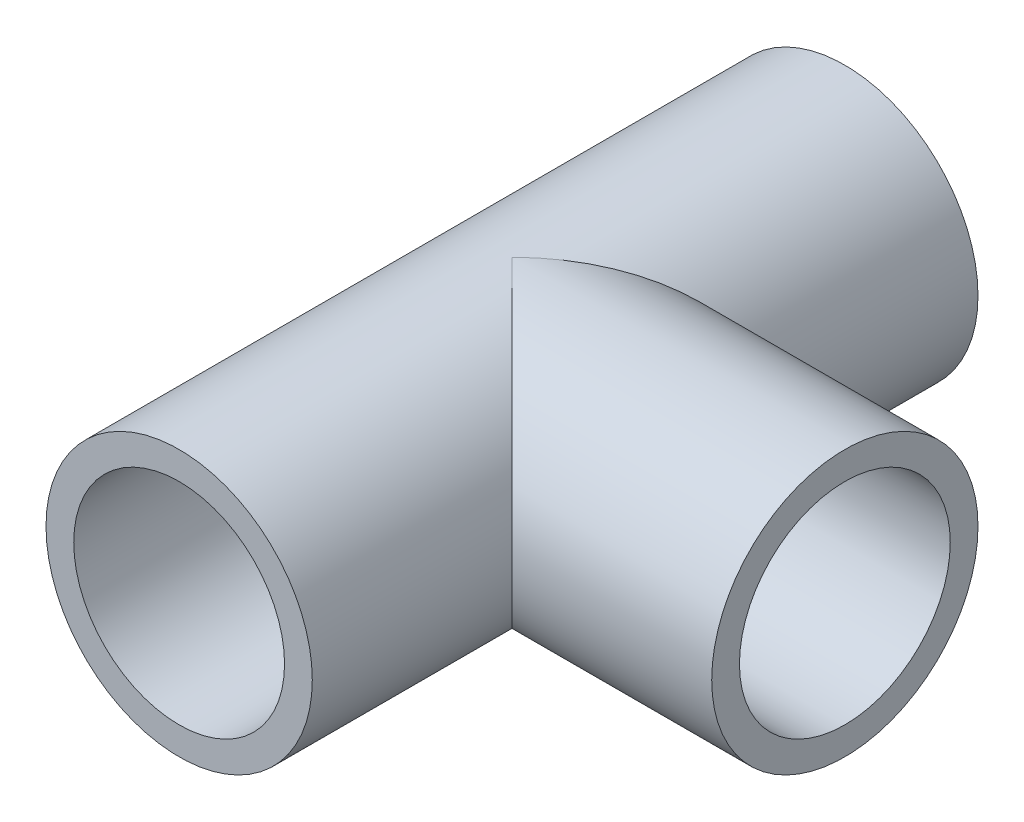
ISO-10303-21;
HEADER;
FILE_DESCRIPTION(('STEP AP214'),'2;1');
FILE_NAME('part.step','',(''),(''),'','','');
FILE_SCHEMA(('AUTOMOTIVE_DESIGN { 1 0 10303 214 1 1 1 1 }'));
ENDSEC;
DATA;
#1=APPLICATION_CONTEXT('core data for automotive mechanical design processes');
#2=APPLICATION_PROTOCOL_DEFINITION('international standard','automotive_design',2000,#1);
#3=PRODUCT_CONTEXT('',#1,'mechanical');
#4=PRODUCT('Part','Part','',(#3));
#5=PRODUCT_RELATED_PRODUCT_CATEGORY('part','',(#4));
#6=PRODUCT_DEFINITION_FORMATION('','',#4);
#7=PRODUCT_DEFINITION_CONTEXT('part definition',#1,'design');
#8=PRODUCT_DEFINITION('design','',#6,#7);
#9=PRODUCT_DEFINITION_SHAPE('','',#8);
#10=(LENGTH_UNIT() NAMED_UNIT(*) SI_UNIT(.MILLI.,.METRE.));
#11=(NAMED_UNIT(*) PLANE_ANGLE_UNIT() SI_UNIT($,.RADIAN.));
#12=(NAMED_UNIT(*) SI_UNIT($,.STERADIAN.) SOLID_ANGLE_UNIT());
#13=UNCERTAINTY_MEASURE_WITH_UNIT(LENGTH_MEASURE(1.E-05),#10,'distance_accuracy_value','');
#14=(GEOMETRIC_REPRESENTATION_CONTEXT(3) GLOBAL_UNCERTAINTY_ASSIGNED_CONTEXT((#13)) GLOBAL_UNIT_ASSIGNED_CONTEXT((#10,
#11,#12)) REPRESENTATION_CONTEXT('',''));
#15=CARTESIAN_POINT('',(0.,0.,0.));
#16=DIRECTION('',(0.,0.,1.));
#17=DIRECTION('',(1.,0.,0.));
#18=AXIS2_PLACEMENT_3D('',#15,#16,#17);
#19=CARTESIAN_POINT('',(0.,0.,152.4));
#20=DIRECTION('',(0.,0.,1.));
#21=DIRECTION('',(1.,0.,0.));
#22=AXIS2_PLACEMENT_3D('',#19,#20,#21);
#23=PLANE('',#22);
#24=CARTESIAN_POINT('',(0.,0.,152.4));
#25=DIRECTION('',(0.,0.,1.));
#26=DIRECTION('',(1.,0.,0.));
#27=AXIS2_PLACEMENT_3D('',#24,#25,#26);
#28=CIRCLE('',#27,30.48);
#29=CARTESIAN_POINT('',(30.48,0.,152.4));
#30=VERTEX_POINT('',#29);
#31=EDGE_CURVE('E58',#30,#30,#28,.T.);
#32=ORIENTED_EDGE('',*,*,#31,.T.);
#33=EDGE_LOOP('',(#32));
#34=FACE_BOUND('',#33,.T.);
#35=CARTESIAN_POINT('',(0.,0.,152.4));
#36=DIRECTION('',(0.,0.,1.));
#37=DIRECTION('',(1.,0.,0.));
#38=AXIS2_PLACEMENT_3D('',#35,#36,#37);
#39=CIRCLE('',#38,24.13);
#40=CARTESIAN_POINT('',(-24.13,0.,152.4));
#41=VERTEX_POINT('',#40);
#42=EDGE_CURVE('E87',#41,#41,#39,.T.);
#43=ORIENTED_EDGE('',*,*,#42,.F.);
#44=EDGE_LOOP('',(#43));
#45=FACE_BOUND('',#44,.T.);
#46=ADVANCED_FACE('F45',(#34,#45),#23,.T.);
#47=CARTESIAN_POINT('',(0.,0.,0.));
#48=DIRECTION('',(0.,0.,1.));
#49=DIRECTION('',(1.,0.,0.));
#50=AXIS2_PLACEMENT_3D('',#47,#48,#49);
#51=PLANE('',#50);
#52=CARTESIAN_POINT('',(0.,0.,0.));
#53=DIRECTION('',(0.,0.,1.));
#54=DIRECTION('',(1.,0.,0.));
#55=AXIS2_PLACEMENT_3D('',#52,#53,#54);
#56=CIRCLE('',#55,30.48);
#57=CARTESIAN_POINT('',(30.48,0.,0.));
#58=VERTEX_POINT('',#57);
#59=EDGE_CURVE('E91',#58,#58,#56,.T.);
#60=ORIENTED_EDGE('',*,*,#59,.F.);
#61=EDGE_LOOP('',(#60));
#62=FACE_BOUND('',#61,.T.);
#63=CARTESIAN_POINT('',(0.,0.,0.));
#64=DIRECTION('',(0.,0.,1.));
#65=DIRECTION('',(1.,0.,0.));
#66=AXIS2_PLACEMENT_3D('',#63,#64,#65);
#67=CIRCLE('',#66,24.13);
#68=CARTESIAN_POINT('',(-24.13,0.,0.));
#69=VERTEX_POINT('',#68);
#70=EDGE_CURVE('E83',#69,#69,#67,.T.);
#71=ORIENTED_EDGE('',*,*,#70,.T.);
#72=EDGE_LOOP('',(#71));
#73=FACE_BOUND('',#72,.T.);
#74=ADVANCED_FACE('F101',(#62,#73),#51,.F.);
#75=CARTESIAN_POINT('',(0.,0.,152.4));
#76=DIRECTION('',(0.,0.,-1.));
#77=DIRECTION('',(-1.,0.,0.));
#78=AXIS2_PLACEMENT_3D('',#75,#76,#77);
#79=CYLINDRICAL_SURFACE('',#78,30.48);
#80=CARTESIAN_POINT('',(5.6843418860808E-11,0.,76.2));
#81=DIRECTION('',(0.707106781186548,0.,0.707106781186547));
#82=DIRECTION('',(0.707106781186548,0.,-0.707106781186547));
#83=AXIS2_PLACEMENT_3D('',#80,#81,#82);
#84=ELLIPSE('',#83,43.1052293811319,30.48);
#85=CARTESIAN_POINT('',(0.,-30.48,76.2));
#86=VERTEX_POINT('',#85);
#87=CARTESIAN_POINT('',(5.6843418860808E-11,30.48,76.2));
#88=VERTEX_POINT('',#87);
#89=EDGE_CURVE('E68',#86,#88,#84,.T.);
#90=ORIENTED_EDGE('',*,*,#89,.F.);
#91=CARTESIAN_POINT('',(5.6843418860808E-11,0.,76.2));
#92=DIRECTION('',(0.707106781186548,0.,-0.707106781186547));
#93=DIRECTION('',(0.707106781186548,0.,0.707106781186547));
#94=AXIS2_PLACEMENT_3D('',#91,#92,#93);
#95=ELLIPSE('',#94,43.1052293811319,30.48);
#96=EDGE_CURVE('E66',#88,#86,#95,.T.);
#97=ORIENTED_EDGE('',*,*,#96,.F.);
#98=EDGE_LOOP('',(#90,#97));
#99=FACE_BOUND('',#98,.T.);
#100=ORIENTED_EDGE('',*,*,#31,.F.);
#101=EDGE_LOOP('',(#100));
#102=FACE_BOUND('',#101,.T.);
#103=ORIENTED_EDGE('',*,*,#59,.T.);
#104=EDGE_LOOP('',(#103));
#105=FACE_BOUND('',#104,.T.);
#106=ADVANCED_FACE('F47',(#99,#102,#105),#79,.T.);
#107=CARTESIAN_POINT('',(0.,0.,152.4));
#108=DIRECTION('',(0.,0.,-1.));
#109=DIRECTION('',(-1.,0.,0.));
#110=AXIS2_PLACEMENT_3D('',#107,#108,#109);
#111=CYLINDRICAL_SURFACE('',#110,24.13);
#112=CARTESIAN_POINT('',(-24.13,0.,152.4));
#113=CARTESIAN_POINT('',(-24.13,0.,150.8125));
#114=CARTESIAN_POINT('',(-24.13,0.,149.225));
#115=CARTESIAN_POINT('',(-24.13,0.,146.05));
#116=CARTESIAN_POINT('',(-24.13,0.,144.4625));
#117=CARTESIAN_POINT('',(-24.13,0.,141.2875));
#118=CARTESIAN_POINT('',(-24.13,0.,139.7));
#119=CARTESIAN_POINT('',(-24.13,0.,136.525));
#120=CARTESIAN_POINT('',(-24.13,0.,134.9375));
#121=CARTESIAN_POINT('',(-24.13,0.,131.7625));
#122=CARTESIAN_POINT('',(-24.13,0.,130.175));
#123=CARTESIAN_POINT('',(-24.13,0.,127.));
#124=CARTESIAN_POINT('',(-24.13,0.,125.4125));
#125=CARTESIAN_POINT('',(-24.13,0.,122.2375));
#126=CARTESIAN_POINT('',(-24.13,0.,120.65));
#127=CARTESIAN_POINT('',(-24.13,0.,117.475));
#128=CARTESIAN_POINT('',(-24.13,0.,115.8875));
#129=CARTESIAN_POINT('',(-24.13,0.,112.7125));
#130=CARTESIAN_POINT('',(-24.13,0.,111.125));
#131=CARTESIAN_POINT('',(-24.13,0.,107.95));
#132=CARTESIAN_POINT('',(-24.13,0.,106.3625));
#133=CARTESIAN_POINT('',(-24.13,0.,103.1875));
#134=CARTESIAN_POINT('',(-24.13,0.,101.6));
#135=CARTESIAN_POINT('',(-24.13,0.,98.425));
#136=CARTESIAN_POINT('',(-24.13,0.,96.8375));
#137=CARTESIAN_POINT('',(-24.13,0.,93.6625));
#138=CARTESIAN_POINT('',(-24.13,0.,92.075));
#139=CARTESIAN_POINT('',(-24.13,0.,88.9));
#140=CARTESIAN_POINT('',(-24.13,0.,87.3125));
#141=CARTESIAN_POINT('',(-24.13,0.,84.1375));
#142=CARTESIAN_POINT('',(-24.13,0.,82.55));
#143=CARTESIAN_POINT('',(-24.13,0.,79.375));
#144=CARTESIAN_POINT('',(-24.13,0.,77.7875));
#145=CARTESIAN_POINT('',(-24.13,0.,74.6125));
#146=CARTESIAN_POINT('',(-24.13,0.,73.025));
#147=CARTESIAN_POINT('',(-24.13,0.,69.85));
#148=CARTESIAN_POINT('',(-24.13,0.,68.2625));
#149=CARTESIAN_POINT('',(-24.13,0.,65.0875));
#150=CARTESIAN_POINT('',(-24.13,0.,63.5));
#151=CARTESIAN_POINT('',(-24.13,0.,60.325));
#152=CARTESIAN_POINT('',(-24.13,0.,58.7375));
#153=CARTESIAN_POINT('',(-24.13,0.,55.5625));
#154=CARTESIAN_POINT('',(-24.13,0.,53.975));
#155=CARTESIAN_POINT('',(-24.13,0.,50.8));
#156=CARTESIAN_POINT('',(-24.13,0.,49.2125));
#157=CARTESIAN_POINT('',(-24.13,0.,46.0375));
#158=CARTESIAN_POINT('',(-24.13,0.,44.45));
#159=CARTESIAN_POINT('',(-24.13,0.,41.275));
#160=CARTESIAN_POINT('',(-24.13,0.,39.6875));
#161=CARTESIAN_POINT('',(-24.13,0.,36.5125));
#162=CARTESIAN_POINT('',(-24.13,0.,34.925));
#163=CARTESIAN_POINT('',(-24.13,0.,31.75));
#164=CARTESIAN_POINT('',(-24.13,0.,30.1625));
#165=CARTESIAN_POINT('',(-24.13,0.,26.9875));
#166=CARTESIAN_POINT('',(-24.13,0.,25.4));
#167=CARTESIAN_POINT('',(-24.13,0.,22.225));
#168=CARTESIAN_POINT('',(-24.13,0.,20.6375));
#169=CARTESIAN_POINT('',(-24.13,0.,17.4625));
#170=CARTESIAN_POINT('',(-24.13,0.,15.875));
#171=CARTESIAN_POINT('',(-24.13,0.,12.7));
#172=CARTESIAN_POINT('',(-24.13,0.,11.1125));
#173=CARTESIAN_POINT('',(-24.13,0.,7.93750000000001));
#174=CARTESIAN_POINT('',(-24.13,0.,6.35));
#175=CARTESIAN_POINT('',(-24.13,0.,3.175));
#176=CARTESIAN_POINT('',(-24.13,0.,1.5875));
#177=CARTESIAN_POINT('',(-24.13,0.,0.));
#178=B_SPLINE_CURVE_WITH_KNOTS('',3,(#112,#113,#114,#115,#116,#117,#118,#119,#120,#121,#122,
#123,#124,#125,#126,#127,#128,#129,#130,#131,#132,#133,#134,#135,#136,#137,#138,#139,#140,#141,
#142,#143,#144,#145,#146,#147,#148,#149,#150,#151,#152,#153,#154,#155,#156,#157,#158,#159,#160,
#161,#162,#163,#164,#165,#166,#167,#168,#169,#170,#171,#172,#173,#174,#175,#176,#177),
.UNSPECIFIED.,.F.,.F.,(4,2,2,2,2,2,2,2,2,2,2,2,2,2,2,2,2,2,2,2,2,2,2,2,2,2,2,2,2,2,2,2,4),(0.,
4.7625,9.52500000000001,14.2875,19.05,23.8125,28.575,33.3375,38.1,42.8625,47.625,52.3875,57.15,
61.9125,66.675,71.4375,76.2,80.9625,85.725,90.4875,95.25,100.0125,104.775,109.5375,114.3,
119.0625,123.825,128.5875,133.35,138.1125,142.875,147.6375,152.4),.UNSPECIFIED.);
#179=EDGE_CURVE('BSEAM106',#41,#69,#178,.T.);
#180=ORIENTED_EDGE('',*,*,#42,.T.);
#181=ORIENTED_EDGE('',*,*,#70,.F.);
#182=ORIENTED_EDGE('',*,*,#179,.T.);
#183=ORIENTED_EDGE('',*,*,#179,.F.);
#184=EDGE_LOOP('',(#180,#182,#181,#183));
#185=FACE_BOUND('',#184,.T.);
#186=ADVANCED_FACE('F106',(#185),#111,.F.);
#187=CARTESIAN_POINT('',(76.2,0.,76.2));
#188=DIRECTION('',(1.,0.,0.));
#189=DIRECTION('',(0.,0.,-1.));
#190=AXIS2_PLACEMENT_3D('',#187,#188,#189);
#191=PLANE('',#190);
#192=CARTESIAN_POINT('',(76.2,0.,76.2));
#193=DIRECTION('',(1.,0.,0.));
#194=DIRECTION('',(0.,0.,-1.));
#195=AXIS2_PLACEMENT_3D('',#192,#193,#194);
#196=CIRCLE('',#195,24.13);
#197=CARTESIAN_POINT('',(76.2,0.,52.07));
#198=VERTEX_POINT('',#197);
#199=EDGE_CURVE('E72',#198,#198,#196,.T.);
#200=ORIENTED_EDGE('',*,*,#199,.F.);
#201=EDGE_LOOP('',(#200));
#202=FACE_BOUND('',#201,.T.);
#203=CARTESIAN_POINT('',(76.2,0.,76.2));
#204=DIRECTION('',(1.,0.,0.));
#205=DIRECTION('',(0.,0.,-1.));
#206=AXIS2_PLACEMENT_3D('',#203,#204,#205);
#207=CIRCLE('',#206,30.48);
#208=CARTESIAN_POINT('',(76.2,0.,45.72));
#209=VERTEX_POINT('',#208);
#210=EDGE_CURVE('E79',#209,#209,#207,.T.);
#211=ORIENTED_EDGE('',*,*,#210,.T.);
#212=EDGE_LOOP('',(#211));
#213=FACE_BOUND('',#212,.T.);
#214=ADVANCED_FACE('F108',(#202,#213),#191,.T.);
#215=CARTESIAN_POINT('',(-500000.,0.,76.2));
#216=DIRECTION('',(1.,0.,0.));
#217=DIRECTION('',(0.,0.,-1.));
#218=AXIS2_PLACEMENT_3D('',#215,#216,#217);
#219=CYLINDRICAL_SURFACE('',#218,30.48);
#220=ORIENTED_EDGE('',*,*,#210,.F.);
#221=EDGE_LOOP('',(#220));
#222=FACE_BOUND('',#221,.T.);
#223=ORIENTED_EDGE('',*,*,#89,.T.);
#224=ORIENTED_EDGE('',*,*,#96,.T.);
#225=EDGE_LOOP('',(#223,#224));
#226=FACE_BOUND('',#225,.T.);
#227=ADVANCED_FACE('F69',(#222,#226),#219,.T.);
#228=CARTESIAN_POINT('',(-500000.,0.,76.2));
#229=DIRECTION('',(1.,0.,0.));
#230=DIRECTION('',(0.,0.,-1.));
#231=AXIS2_PLACEMENT_3D('',#228,#229,#230);
#232=CYLINDRICAL_SURFACE('',#231,24.13);
#233=ORIENTED_EDGE('',*,*,#199,.T.);
#234=EDGE_LOOP('',(#233));
#235=FACE_BOUND('',#234,.T.);
#236=CARTESIAN_POINT('',(30.4800000001137,0.,52.07));
#237=CARTESIAN_POINT('',(30.4799985942119,-0.581246894137445,52.0700014456354));
#238=CARTESIAN_POINT('',(30.4633388317552,-1.16251470497403,52.091035349071));
#239=CARTESIAN_POINT('',(30.3970841513564,-2.32037410054405,52.1748074891283));
#240=CARTESIAN_POINT('',(30.3474747640671,-2.89696351818204,52.2375640476573));
#241=CARTESIAN_POINT('',(30.2163718223756,-4.04148642333223,52.403818789128));
#242=CARTESIAN_POINT('',(30.1348272642911,-4.60940454687885,52.5073821462631));
#243=CARTESIAN_POINT('',(29.9417004169538,-5.73140885237527,52.753513298852));
#244=CARTESIAN_POINT('',(29.8301207860515,-6.28549625371716,52.8960776424164));
#245=CARTESIAN_POINT('',(29.580049299476,-7.3729554111217,53.2170526205287));
#246=CARTESIAN_POINT('',(29.4417297807024,-7.90643488721635,53.3952339433838));
#247=CARTESIAN_POINT('',(29.1403774063328,-8.95352707975394,53.7856408718759));
#248=CARTESIAN_POINT('',(28.9773445357199,-9.46713978412478,53.9978664981997));
#249=CARTESIAN_POINT('',(28.6294317444963,-10.472291669237,54.4539063097545));
#250=CARTESIAN_POINT('',(28.4445552601586,-10.9638343051306,54.6977155270727));
#251=CARTESIAN_POINT('',(28.0558015884944,-11.9235263112645,55.2146824691518));
#252=CARTESIAN_POINT('',(27.851920555446,-12.3916709171557,55.4878461357363));
#253=CARTESIAN_POINT('',(27.4977387757521,-13.153661272496,55.9671318513638));
#254=CARTESIAN_POINT('',(27.3518215745773,-13.4542731656338,56.1658225757648));
#255=CARTESIAN_POINT('',(27.0536857454353,-14.0441335745673,56.5748124928946));
#256=CARTESIAN_POINT('',(26.9014684672375,-14.3333844987928,56.7851092022682));
#257=CARTESIAN_POINT('',(26.4365242436193,-15.1841428488301,57.4328230796393));
#258=CARTESIAN_POINT('',(26.1155536871627,-15.7285520655082,57.8869984257711));
#259=CARTESIAN_POINT('',(25.4580648187886,-16.7719629712082,58.8374619562241));
#260=CARTESIAN_POINT('',(25.1215078129702,-17.2708413912156,59.333857822967));
#261=CARTESIAN_POINT('',(24.4409695726738,-18.2211638416936,60.3652986931174));
#262=CARTESIAN_POINT('',(24.0969891590444,-18.6726130846125,60.9003394385388));
#263=CARTESIAN_POINT('',(23.4043643390173,-19.5339711800464,62.0160272651951));
#264=CARTESIAN_POINT('',(23.0557272249272,-19.9431567491534,62.5972373064217));
#265=CARTESIAN_POINT('',(22.368327400478,-20.7112017051216,63.7979412423459));
#266=CARTESIAN_POINT('',(22.0295677561269,-21.0700455947201,64.4174468418264));
#267=CARTESIAN_POINT('',(21.374464086002,-21.7342955630196,65.6931839152401));
#268=CARTESIAN_POINT('',(21.0580595106444,-22.0398495616398,66.3493068338784));
#269=CARTESIAN_POINT('',(20.4610451480448,-22.5951764674894,67.7001604063365));
#270=CARTESIAN_POINT('',(20.180405167555,-22.8449965620533,68.3948577737236));
#271=CARTESIAN_POINT('',(19.7786556836564,-23.1921014390932,69.5237585155298));
#272=CARTESIAN_POINT('',(19.639874786779,-23.309513058134,69.945562788649));
#273=CARTESIAN_POINT('',(19.384359305397,-23.5224285366047,70.8012468114712));
#274=CARTESIAN_POINT('',(19.2676211131563,-23.6179359816476,71.235124571742));
#275=CARTESIAN_POINT('',(19.0603980147066,-23.7854874129787,72.1126352892581));
#276=CARTESIAN_POINT('',(18.9698588324466,-23.8575799460593,72.5562460003592));
#277=CARTESIAN_POINT('',(18.8183768590692,-23.9772488230444,73.4518249767898));
#278=CARTESIAN_POINT('',(18.7574337555717,-24.0248254257094,73.903793153856));
#279=CARTESIAN_POINT('',(18.667598676156,-24.0946981440808,74.8166600757999));
#280=CARTESIAN_POINT('',(18.6389734104413,-24.1167839238524,75.277601651473));
#281=CARTESIAN_POINT('',(18.6161373246142,-24.1344163111447,76.2008366939014));
#282=CARTESIAN_POINT('',(18.6219250552584,-24.1299640362696,76.663130102907));
#283=CARTESIAN_POINT('',(18.6676304715153,-24.0946214837498,77.5853697187871));
#284=CARTESIAN_POINT('',(18.7075763769761,-24.0637093462126,78.0453136685015));
#285=CARTESIAN_POINT('',(18.8196352543896,-23.9761697885603,78.9587728587098));
#286=CARTESIAN_POINT('',(18.8917527560269,-23.9195387472642,79.4122871846471));
#287=CARTESIAN_POINT('',(19.079656803023,-23.7700199262005,80.3863313433118));
#288=CARTESIAN_POINT('',(19.2007864190838,-23.672602004331,80.9051311549329));
#289=CARTESIAN_POINT('',(19.4763135689404,-23.4464338144467,81.9267461266002));
#290=CARTESIAN_POINT('',(19.6307185989135,-23.3176764855449,82.4295576555205));
#291=CARTESIAN_POINT('',(19.9666329051073,-23.0306929984754,83.4187228254217));
#292=CARTESIAN_POINT('',(20.1482062348666,-22.8723969741616,83.9050341480601));
#293=CARTESIAN_POINT('',(20.5320936583173,-22.5284268138105,84.8593417759689));
#294=CARTESIAN_POINT('',(20.7344093369573,-22.3427505851416,85.3273366778777));
#295=CARTESIAN_POINT('',(21.2522157831925,-21.8529819454625,86.4587189945083));
#296=CARTESIAN_POINT('',(21.5765483148017,-21.5340020474779,87.1116472010037));
#297=CARTESIAN_POINT('',(22.2443123598574,-20.8435128634672,88.3789099626866));
#298=CARTESIAN_POINT('',(22.5877521161132,-20.4719807982799,88.9932276141525));
#299=CARTESIAN_POINT('',(23.2829128130324,-19.6777850715743,90.1840743588421));
#300=CARTESIAN_POINT('',(23.6346425332549,-19.2550650408457,90.7605606946819));
#301=CARTESIAN_POINT('',(24.3365978359412,-18.3598481914402,91.8742851385629));
#302=CARTESIAN_POINT('',(24.6868236442963,-17.8873591412737,92.4115293498533));
#303=CARTESIAN_POINT('',(25.3853098226737,-16.881926617952,93.4567335151448));
#304=CARTESIAN_POINT('',(25.733351132718,-16.3478675905932,93.9637700355662));
#305=CARTESIAN_POINT('',(26.4110591786436,-15.2287388350468,94.9320588584444));
#306=CARTESIAN_POINT('',(26.7407232622224,-14.6436617747411,95.3933045595808));
#307=CARTESIAN_POINT('',(27.3728352917247,-13.4249040054538,96.2646019065067));
#308=CARTESIAN_POINT('',(27.6753451458894,-12.7913402878299,96.6747708734809));
#309=CARTESIAN_POINT('',(28.1030458124959,-11.8058281807155,97.2481301212219));
#310=CARTESIAN_POINT('',(28.2412527642329,-11.4715078033352,97.4322467534314));
#311=CARTESIAN_POINT('',(28.5080732910351,-10.7913669495902,97.7858803393804));
#312=CARTESIAN_POINT('',(28.6366845587928,-10.445543736055,97.9553937832503));
#313=CARTESIAN_POINT('',(28.9345891038834,-9.59676128342873,98.3463085422909));
#314=CARTESIAN_POINT('',(29.0985384026382,-9.08830139511949,98.5599454532803));
#315=CARTESIAN_POINT('',(29.4022432743977,-8.05171445079065,98.9537714942912));
#316=CARTESIAN_POINT('',(29.5420048443308,-7.52359230925733,99.1339689158579));
#317=CARTESIAN_POINT('',(29.7947233050319,-6.45046553954492,99.4585987488549));
#318=CARTESIAN_POINT('',(29.9076939409085,-5.90546973138583,99.6030495018022));
#319=CARTESIAN_POINT('',(30.1046311883752,-4.80165091687515,99.8542046406014));
#320=CARTESIAN_POINT('',(30.1885969919579,-4.24282752578392,99.9609079749));
#321=CARTESIAN_POINT('',(30.326022657895,-3.11260689792302,100.135267883198));
#322=CARTESIAN_POINT('',(30.3793347391836,-2.54116231618754,100.202735319141));
#323=CARTESIAN_POINT('',(30.4535962770317,-1.39280565225359,100.296656527571));
#324=CARTESIAN_POINT('',(30.474545803072,-0.815893581796225,100.323110388111));
#325=CARTESIAN_POINT('',(30.4835853371063,0.33855942208638,100.334528925288));
#326=CARTESIAN_POINT('',(30.4716775357029,0.916100311022057,100.31949636783));
#327=CARTESIAN_POINT('',(30.4152889024034,2.06700511238335,100.248217736484));
#328=CARTESIAN_POINT('',(30.3708094319393,2.64036919837955,100.191973385168));
#329=CARTESIAN_POINT('',(30.2547306081588,3.73671662549186,100.044854686807));
#330=CARTESIAN_POINT('',(30.1853499981981,4.26032035769587,99.9568105546935));
#331=CARTESIAN_POINT('',(30.0208433591845,5.29666041108767,99.7474357513878));
#332=CARTESIAN_POINT('',(29.9257188362346,5.80939736612583,99.6261070274477));
#333=CARTESIAN_POINT('',(29.7114282829551,6.82121162654453,99.3517344480323));
#334=CARTESIAN_POINT('',(29.5922590548049,7.32028710498296,99.1986863739752));
#335=CARTESIAN_POINT('',(29.3318868043604,8.30234502836455,98.8626864178246));
#336=CARTESIAN_POINT('',(29.1906825442837,8.78532656740606,98.6797328558113));
#337=CARTESIAN_POINT('',(28.8777362296886,9.76680476358038,98.2718927043361));
#338=CARTESIAN_POINT('',(28.7045411025276,10.2639848666116,98.0449561561476));
#339=CARTESIAN_POINT('',(28.3381996694847,11.2359529291514,97.5612965717071));
#340=CARTESIAN_POINT('',(28.1450526335112,11.7107400683171,97.3045724454085));
#341=CARTESIAN_POINT('',(27.7416189350939,12.6367760477007,96.7634735736257));
#342=CARTESIAN_POINT('',(27.5313289747734,13.0880203313403,96.479093505779));
#343=CARTESIAN_POINT('',(27.0964713757181,13.9660926440177,95.8846722218586));
#344=CARTESIAN_POINT('',(26.8719018010717,14.3929173474863,95.5746275246604));
#345=CARTESIAN_POINT('',(26.3669383252561,15.3014562655518,94.8685322947709));
#346=CARTESIAN_POINT('',(26.084125702579,15.7778996424423,94.4674210020904));
#347=CARTESIAN_POINT('',(25.5070424047468,16.6947499775402,93.6334841221191));
#348=CARTESIAN_POINT('',(25.2127701598319,17.135151972925,93.2006541827386));
#349=CARTESIAN_POINT('',(24.617320407494,17.9801392041306,92.3043896375146));
#350=CARTESIAN_POINT('',(24.3161338233301,18.3846735176863,91.8409131004348));
#351=CARTESIAN_POINT('',(23.7125544599859,19.1568595064524,90.8849982328901));
#352=CARTESIAN_POINT('',(23.410161747286,19.5245131860547,90.3925614786672));
#353=CARTESIAN_POINT('',(22.8075178283164,20.2253007497051,89.3749359986963));
#354=CARTESIAN_POINT('',(22.5073051120847,20.5581234518638,88.8495097550985));
#355=CARTESIAN_POINT('',(21.9185096019988,21.1847632130208,87.7694706724776));
#356=CARTESIAN_POINT('',(21.6299289994542,21.4785729462774,87.2148523790822));
#357=CARTESIAN_POINT('',(21.0732137686323,22.0250268884764,86.0768781107503));
#358=CARTESIAN_POINT('',(20.8050471047872,22.2777363353324,85.4935696309247));
#359=CARTESIAN_POINT('',(20.4255971529862,22.6242089102541,84.5967059478788));
#360=CARTESIAN_POINT('',(20.3029347953843,22.7342501813989,84.2941602561583));
#361=CARTESIAN_POINT('',(20.0666095193717,22.9431128314974,83.6816578025718));
#362=CARTESIAN_POINT('',(19.9529486278867,23.0419316855796,83.3716993918722));
#363=CARTESIAN_POINT('',(19.700500705975,23.2584762609127,82.6412146470298));
#364=CARTESIAN_POINT('',(19.5657804193436,23.3716977938961,82.2179190149771));
#365=CARTESIAN_POINT('',(19.3190694532009,23.5760396424176,81.3596276594423));
#366=CARTESIAN_POINT('',(19.2070712128244,23.6671673117655,80.9246358826521));
#367=CARTESIAN_POINT('',(19.0098923728794,23.8258352691401,80.0452128238777));
#368=CARTESIAN_POINT('',(18.9246604847468,23.8934206953141,79.6008013584024));
#369=CARTESIAN_POINT('',(18.7842601105798,24.0039582267397,78.704170479054));
#370=CARTESIAN_POINT('',(18.7290910092759,24.0469108361313,78.2519512251717));
#371=CARTESIAN_POINT('',(18.6511143494709,24.1074435690673,77.3395629410358));
#372=CARTESIAN_POINT('',(18.6285525499973,24.1248310266293,76.879359726755));
#373=CARTESIAN_POINT('',(18.6177300001449,24.1331842267428,75.9583202995965));
#374=CARTESIAN_POINT('',(18.6294681663843,24.1241508038111,75.4974841071713));
#375=CARTESIAN_POINT('',(18.686665020414,24.0798718906779,74.578769716168));
#376=CARTESIAN_POINT('',(18.732155546232,24.044601651652,74.1208947224574));
#377=CARTESIAN_POINT('',(18.854658307874,23.9486585457968,73.2120967265391));
#378=CARTESIAN_POINT('',(18.9316751369376,23.8879819773507,72.7611747472922));
#379=CARTESIAN_POINT('',(19.1313448937145,23.7284920776158,71.7834765927196));
#380=CARTESIAN_POINT('',(19.2599179692727,23.6245958871216,71.2587420557253));
#381=CARTESIAN_POINT('',(19.5503160636427,23.3848428914026,70.2261186481258));
#382=CARTESIAN_POINT('',(19.7121493084578,23.248978178422,69.7182339810398));
#383=CARTESIAN_POINT('',(20.0626535840953,22.9471975817094,68.7196405763208));
#384=CARTESIAN_POINT('',(20.2513879882148,22.7812104764562,68.2289759071473));
#385=CARTESIAN_POINT('',(20.6491495614728,22.4213074642196,67.2665876387292));
#386=CARTESIAN_POINT('',(20.8581781082568,22.2273896607592,66.7948653284427));
#387=CARTESIAN_POINT('',(21.390040728314,21.7183509188199,65.6588754092976));
#388=CARTESIAN_POINT('',(21.721222179389,21.3883442900551,65.0051529293278));
#389=CARTESIAN_POINT('',(22.4012009791076,20.6751003492359,63.7369894921029));
#390=CARTESIAN_POINT('',(22.7500056844201,20.2918406883797,63.1225651861101));
#391=CARTESIAN_POINT('',(23.45440699751,19.4733934884016,61.9323483965165));
#392=CARTESIAN_POINT('',(23.8100102398364,19.0381527949134,61.356596414248));
#393=CARTESIAN_POINT('',(24.5181952385069,18.1170104435167,60.2453282438488));
#394=CARTESIAN_POINT('',(24.8707774565334,17.6311166815875,59.7098058069214));
#395=CARTESIAN_POINT('',(25.5711291411098,16.5995098760729,58.6711996722963));
#396=CARTESIAN_POINT('',(25.9186838056949,16.05284464162,58.1689142411923));
#397=CARTESIAN_POINT('',(26.5937060615237,14.9079452459512,57.2114005966662));
#398=CARTESIAN_POINT('',(26.9211705538886,14.3097031631433,56.7561796354849));
#399=CARTESIAN_POINT('',(27.5469999624706,13.0643722122339,55.8985363650718));
#400=CARTESIAN_POINT('',(27.8454260596338,12.4173913725568,55.4960024032841));
#401=CARTESIAN_POINT('',(28.4055859792328,11.0761235896465,54.7485429624994));
#402=CARTESIAN_POINT('',(28.667339113584,10.3818618328871,54.4035871445037));
#403=CARTESIAN_POINT('',(29.0737682711777,9.16648046331121,53.8722100490467));
#404=CARTESIAN_POINT('',(29.2299408790722,8.65631789602964,53.6693578405444));
#405=CARTESIAN_POINT('',(29.5177915131619,7.61714328461488,53.2971516351164));
#406=CARTESIAN_POINT('',(29.6494713113482,7.08813260739557,53.1277952148012));
#407=CARTESIAN_POINT('',(29.8856034094067,6.01516771222428,52.8251260604964));
#408=CARTESIAN_POINT('',(29.9901115607452,5.47124672933795,52.6917393691921));
#409=CARTESIAN_POINT('',(30.1701058402263,4.3710011022155,52.4625438119806));
#410=CARTESIAN_POINT('',(30.245603187303,3.81468134101623,52.3667204194657));
#411=CARTESIAN_POINT('',(30.3634552076486,2.71710292890371,52.2173411929071));
#412=CARTESIAN_POINT('',(30.4070744671621,2.17619990910373,52.1621717853081));
#413=CARTESIAN_POINT('',(30.4653511517049,1.09020473547196,52.0884959169267));
#414=CARTESIAN_POINT('',(30.4800013186125,0.545111566143733,52.0699986442378));
#415=CARTESIAN_POINT('',(30.4800000001137,0.,52.07));
#416=B_SPLINE_CURVE_WITH_KNOTS('',3,(#236,#237,#238,#239,#240,#241,#242,#243,#244,#245,#246,
#247,#248,#249,#250,#251,#252,#253,#254,#255,#256,#257,#258,#259,#260,#261,#262,#263,#264,#265,
#266,#267,#268,#269,#270,#271,#272,#273,#274,#275,#276,#277,#278,#279,#280,#281,#282,#283,#284,
#285,#286,#287,#288,#289,#290,#291,#292,#293,#294,#295,#296,#297,#298,#299,#300,#301,#302,#303,
#304,#305,#306,#307,#308,#309,#310,#311,#312,#313,#314,#315,#316,#317,#318,#319,#320,#321,#322,
#323,#324,#325,#326,#327,#328,#329,#330,#331,#332,#333,#334,#335,#336,#337,#338,#339,#340,#341,
#342,#343,#344,#345,#346,#347,#348,#349,#350,#351,#352,#353,#354,#355,#356,#357,#358,#359,#360,
#361,#362,#363,#364,#365,#366,#367,#368,#369,#370,#371,#372,#373,#374,#375,#376,#377,#378,#379,
#380,#381,#382,#383,#384,#385,#386,#387,#388,#389,#390,#391,#392,#393,#394,#395,#396,#397,#398,
#399,#400,#401,#402,#403,#404,#405,#406,#407,#408,#409,#410,#411,#412,#413,#414,#415),
.UNSPECIFIED.,.T.,.F.,(4,2,2,2,2,2,2,2,2,2,2,2,2,2,2,2,2,2,2,2,2,2,2,2,2,2,2,2,2,2,2,2,2,2,2,2,
2,2,2,2,2,2,2,2,2,2,2,2,2,2,2,2,2,2,2,2,2,2,2,2,2,2,2,2,2,2,2,2,2,2,2,2,2,2,2,2,2,2,2,2,2,2,2,2,
2,2,2,2,2,4),(0.,1.74316431290435,3.48709461755298,5.23382158799999,6.98039400957661,
8.71606411850964,10.4517352821125,12.187133765614,13.9228841863641,15.0887991092917,
16.2544655191609,18.586193256672,20.9240573793711,23.2616643023458,25.6342759671658,
28.0076164252899,30.3742604182582,32.738893013526,34.1158089120365,35.4924992545917,
36.8663167700953,38.2401197849373,39.6251793860445,41.0101806581895,42.3963272587486,
43.782669087091,45.404944698558,47.027586153751,48.6541153455796,50.2807689152999,
52.6646601176295,55.0495878215665,57.4371661566374,59.8243723622494,62.2649579232012,
64.7058948157699,67.1411172930193,68.3584189879237,69.5760124491651,71.3003219556106,
73.0242033350043,74.7471983530599,76.4702413658808,78.2015229558297,79.9328008287942,
81.6639632800132,83.3950533761648,84.9996729228663,86.6041986143614,88.2089378402314,
89.8137672421993,91.5320366299488,93.2503689158878,94.969032550306,96.6879296857116,
98.7380369861999,100.788426108824,102.841681106048,104.89482445227,106.964975522085,
109.035514770764,111.102734710589,112.135955642249,113.169408574149,114.543500798808,
115.917135035303,117.288120880485,118.659078665805,120.040316329322,121.421510366221,
122.804008919016,124.186708967319,125.83464359912,127.482986294507,129.135278356789,
130.787682661617,133.19537142789,135.604073702673,138.015260485317,140.426071964093,
142.882167405488,145.338640748326,147.789821090872,150.239705755353,151.950457038323,
153.661084504704,155.368167460223,157.074589593955,158.708974316517,160.343768477547),.UNSPECIFIED.);
#417=CARTESIAN_POINT('',(30.4800000001137,0.,52.07));
#418=VERTEX_POINT('',#417);
#419=EDGE_CURVE('E12',#418,#418,#416,.T.);
#420=ORIENTED_EDGE('',*,*,#419,.T.);
#421=EDGE_LOOP('',(#420));
#422=FACE_BOUND('',#421,.T.);
#423=ADVANCED_FACE('F111',(#235,#422),#232,.F.);
#424=ORIENTED_EDGE('',*,*,#419,.F.);
#425=EDGE_LOOP('',(#424));
#426=FACE_BOUND('',#425,.T.);
#427=ADVANCED_FACE('F118',(#426),#79,.T.);
#428=CLOSED_SHELL('',(#46,#74,#106,#186,#214,#227,#423,#427));
#429=MANIFOLD_SOLID_BREP('B2',#428);
#430=ADVANCED_BREP_SHAPE_REPRESENTATION('',(#18,#429),#14);
#431=SHAPE_DEFINITION_REPRESENTATION(#9,#430);
ENDSEC;
END-ISO-10303-21;
